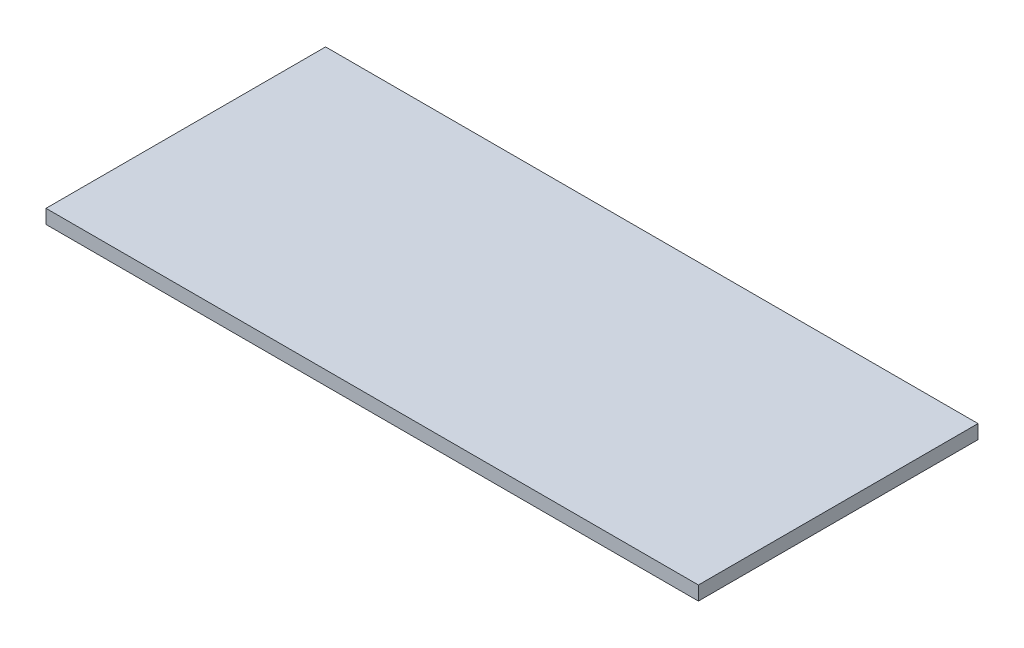
ISO-10303-21;
HEADER;
FILE_DESCRIPTION(('STEP AP214'),'2;1');
FILE_NAME('part.step','',(''),(''),'','','');
FILE_SCHEMA(('AUTOMOTIVE_DESIGN { 1 0 10303 214 1 1 1 1 }'));
ENDSEC;
DATA;
#1=APPLICATION_CONTEXT('core data for automotive mechanical design processes');
#2=APPLICATION_PROTOCOL_DEFINITION('international standard','automotive_design',2000,#1);
#3=PRODUCT_CONTEXT('',#1,'mechanical');
#4=PRODUCT('Part','Part','',(#3));
#5=PRODUCT_RELATED_PRODUCT_CATEGORY('part','',(#4));
#6=PRODUCT_DEFINITION_FORMATION('','',#4);
#7=PRODUCT_DEFINITION_CONTEXT('part definition',#1,'design');
#8=PRODUCT_DEFINITION('design','',#6,#7);
#9=PRODUCT_DEFINITION_SHAPE('','',#8);
#10=(LENGTH_UNIT() NAMED_UNIT(*) SI_UNIT(.MILLI.,.METRE.));
#11=(NAMED_UNIT(*) PLANE_ANGLE_UNIT() SI_UNIT($,.RADIAN.));
#12=(NAMED_UNIT(*) SI_UNIT($,.STERADIAN.) SOLID_ANGLE_UNIT());
#13=UNCERTAINTY_MEASURE_WITH_UNIT(LENGTH_MEASURE(1.E-05),#10,'distance_accuracy_value','');
#14=(GEOMETRIC_REPRESENTATION_CONTEXT(3) GLOBAL_UNCERTAINTY_ASSIGNED_CONTEXT((#13)) GLOBAL_UNIT_ASSIGNED_CONTEXT((#10,
#11,#12)) REPRESENTATION_CONTEXT('',''));
#15=CARTESIAN_POINT('',(0.,0.,0.));
#16=DIRECTION('',(0.,0.,1.));
#17=DIRECTION('',(1.,0.,0.));
#18=AXIS2_PLACEMENT_3D('',#15,#16,#17);
#19=CARTESIAN_POINT('',(350.,15.,150.));
#20=DIRECTION('',(-1.,0.,0.));
#21=DIRECTION('',(0.,0.,1.));
#22=AXIS2_PLACEMENT_3D('',#19,#20,#21);
#23=PLANE('',#22);
#24=DIRECTION('',(0.,0.,-1.));
#25=VECTOR('',#24,1.);
#26=CARTESIAN_POINT('',(350.,0.,150.));
#27=LINE('',#26,#25);
#28=CARTESIAN_POINT('',(350.,0.,150.));
#29=VERTEX_POINT('',#28);
#30=CARTESIAN_POINT('',(350.,0.,-150.));
#31=VERTEX_POINT('',#30);
#32=EDGE_CURVE('E114',#29,#31,#27,.T.);
#33=ORIENTED_EDGE('',*,*,#32,.T.);
#34=DIRECTION('',(0.,-1.,0.));
#35=VECTOR('',#34,1.);
#36=CARTESIAN_POINT('',(350.,15.,-150.));
#37=LINE('',#36,#35);
#38=CARTESIAN_POINT('',(350.,15.,-150.));
#39=VERTEX_POINT('',#38);
#40=EDGE_CURVE('E11',#39,#31,#37,.T.);
#41=ORIENTED_EDGE('',*,*,#40,.F.);
#42=DIRECTION('',(0.,0.,-1.));
#43=VECTOR('',#42,1.);
#44=CARTESIAN_POINT('',(350.,15.,150.));
#45=LINE('',#44,#43);
#46=CARTESIAN_POINT('',(350.,15.,150.));
#47=VERTEX_POINT('',#46);
#48=EDGE_CURVE('E98',#47,#39,#45,.T.);
#49=ORIENTED_EDGE('',*,*,#48,.F.);
#50=DIRECTION('',(0.,-1.,0.));
#51=VECTOR('',#50,1.);
#52=CARTESIAN_POINT('',(350.,15.,150.));
#53=LINE('',#52,#51);
#54=EDGE_CURVE('E110',#47,#29,#53,.T.);
#55=ORIENTED_EDGE('',*,*,#54,.T.);
#56=EDGE_LOOP('',(#33,#41,#49,#55));
#57=FACE_BOUND('',#56,.T.);
#58=ADVANCED_FACE('F46',(#57),#23,.F.);
#59=CARTESIAN_POINT('',(-350.,15.,-150.));
#60=DIRECTION('',(0.,0.,1.));
#61=DIRECTION('',(1.,0.,0.));
#62=AXIS2_PLACEMENT_3D('',#59,#60,#61);
#63=PLANE('',#62);
#64=DIRECTION('',(-1.,0.,0.));
#65=VECTOR('',#64,1.);
#66=CARTESIAN_POINT('',(-350.,0.,-150.));
#67=LINE('',#66,#65);
#68=CARTESIAN_POINT('',(-350.,0.,-150.));
#69=VERTEX_POINT('',#68);
#70=EDGE_CURVE('E103',#31,#69,#67,.T.);
#71=ORIENTED_EDGE('',*,*,#70,.T.);
#72=DIRECTION('',(0.,-1.,0.));
#73=VECTOR('',#72,1.);
#74=CARTESIAN_POINT('',(-350.,15.,-150.));
#75=LINE('',#74,#73);
#76=CARTESIAN_POINT('',(-350.,15.,-150.));
#77=VERTEX_POINT('',#76);
#78=EDGE_CURVE('E55',#77,#69,#75,.T.);
#79=ORIENTED_EDGE('',*,*,#78,.F.);
#80=DIRECTION('',(-1.,0.,0.));
#81=VECTOR('',#80,1.);
#82=CARTESIAN_POINT('',(-350.,15.,-150.));
#83=LINE('',#82,#81);
#84=EDGE_CURVE('E93',#39,#77,#83,.T.);
#85=ORIENTED_EDGE('',*,*,#84,.F.);
#86=ORIENTED_EDGE('',*,*,#40,.T.);
#87=EDGE_LOOP('',(#71,#79,#85,#86));
#88=FACE_BOUND('',#87,.T.);
#89=ADVANCED_FACE('F102',(#88),#63,.F.);
#90=CARTESIAN_POINT('',(-350.,15.,150.));
#91=DIRECTION('',(1.,0.,0.));
#92=DIRECTION('',(0.,0.,-1.));
#93=AXIS2_PLACEMENT_3D('',#90,#91,#92);
#94=PLANE('',#93);
#95=DIRECTION('',(0.,0.,1.));
#96=VECTOR('',#95,1.);
#97=CARTESIAN_POINT('',(-350.,0.,150.));
#98=LINE('',#97,#96);
#99=CARTESIAN_POINT('',(-350.,0.,150.));
#100=VERTEX_POINT('',#99);
#101=EDGE_CURVE('E80',#69,#100,#98,.T.);
#102=ORIENTED_EDGE('',*,*,#101,.T.);
#103=DIRECTION('',(0.,-1.,0.));
#104=VECTOR('',#103,1.);
#105=CARTESIAN_POINT('',(-350.,15.,150.));
#106=LINE('',#105,#104);
#107=CARTESIAN_POINT('',(-350.,15.,150.));
#108=VERTEX_POINT('',#107);
#109=EDGE_CURVE('E105',#108,#100,#106,.T.);
#110=ORIENTED_EDGE('',*,*,#109,.F.);
#111=DIRECTION('',(0.,0.,1.));
#112=VECTOR('',#111,1.);
#113=CARTESIAN_POINT('',(-350.,15.,150.));
#114=LINE('',#113,#112);
#115=EDGE_CURVE('E96',#77,#108,#114,.T.);
#116=ORIENTED_EDGE('',*,*,#115,.F.);
#117=ORIENTED_EDGE('',*,*,#78,.T.);
#118=EDGE_LOOP('',(#102,#110,#116,#117));
#119=FACE_BOUND('',#118,.T.);
#120=ADVANCED_FACE('F106',(#119),#94,.F.);
#121=CARTESIAN_POINT('',(-350.,15.,150.));
#122=DIRECTION('',(0.,0.,-1.));
#123=DIRECTION('',(-1.,0.,0.));
#124=AXIS2_PLACEMENT_3D('',#121,#122,#123);
#125=PLANE('',#124);
#126=DIRECTION('',(1.,0.,0.));
#127=VECTOR('',#126,1.);
#128=CARTESIAN_POINT('',(-350.,0.,150.));
#129=LINE('',#128,#127);
#130=EDGE_CURVE('E86',#100,#29,#129,.T.);
#131=ORIENTED_EDGE('',*,*,#130,.T.);
#132=ORIENTED_EDGE('',*,*,#54,.F.);
#133=DIRECTION('',(1.,0.,0.));
#134=VECTOR('',#133,1.);
#135=CARTESIAN_POINT('',(-350.,15.,150.));
#136=LINE('',#135,#134);
#137=EDGE_CURVE('E63',#108,#47,#136,.T.);
#138=ORIENTED_EDGE('',*,*,#137,.F.);
#139=ORIENTED_EDGE('',*,*,#109,.T.);
#140=EDGE_LOOP('',(#131,#132,#138,#139));
#141=FACE_BOUND('',#140,.T.);
#142=ADVANCED_FACE('F127',(#141),#125,.F.);
#143=CARTESIAN_POINT('',(0.,15.,0.));
#144=DIRECTION('',(0.,-1.,0.));
#145=DIRECTION('',(0.,0.,-1.));
#146=AXIS2_PLACEMENT_3D('',#143,#144,#145);
#147=PLANE('',#146);
#148=ORIENTED_EDGE('',*,*,#48,.T.);
#149=ORIENTED_EDGE('',*,*,#84,.T.);
#150=ORIENTED_EDGE('',*,*,#115,.T.);
#151=ORIENTED_EDGE('',*,*,#137,.T.);
#152=EDGE_LOOP('',(#148,#149,#150,#151));
#153=FACE_BOUND('',#152,.T.);
#154=ADVANCED_FACE('F94',(#153),#147,.F.);
#155=CARTESIAN_POINT('',(0.,0.,0.));
#156=DIRECTION('',(0.,-1.,0.));
#157=DIRECTION('',(0.,0.,-1.));
#158=AXIS2_PLACEMENT_3D('',#155,#156,#157);
#159=PLANE('',#158);
#160=ORIENTED_EDGE('',*,*,#32,.F.);
#161=ORIENTED_EDGE('',*,*,#130,.F.);
#162=ORIENTED_EDGE('',*,*,#101,.F.);
#163=ORIENTED_EDGE('',*,*,#70,.F.);
#164=EDGE_LOOP('',(#160,#161,#162,#163));
#165=FACE_BOUND('',#164,.T.);
#166=ADVANCED_FACE('F130',(#165),#159,.T.);
#167=CLOSED_SHELL('',(#58,#89,#120,#142,#154,#166));
#168=MANIFOLD_SOLID_BREP('B2',#167);
#169=ADVANCED_BREP_SHAPE_REPRESENTATION('',(#18,#168),#14);
#170=SHAPE_DEFINITION_REPRESENTATION(#9,#169);
ENDSEC;
END-ISO-10303-21;
